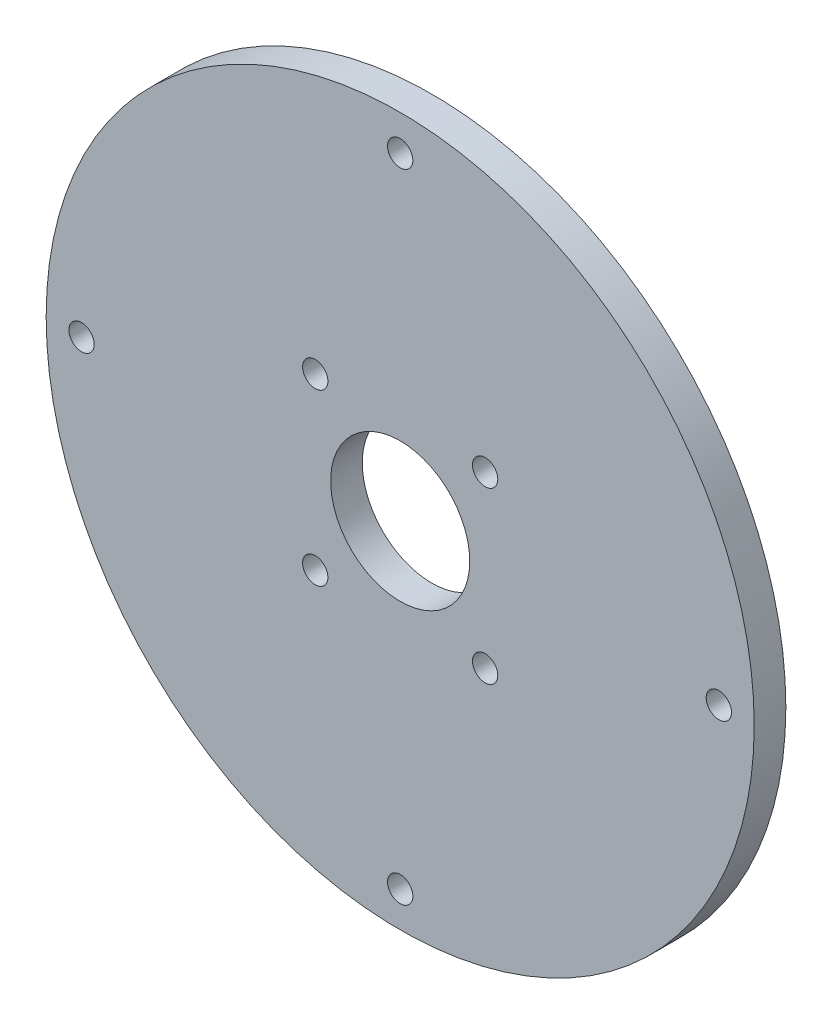
ISO-10303-21;
HEADER;
FILE_DESCRIPTION(('STEP AP214'),'2;1');
FILE_NAME('part.step','',(''),(''),'','','');
FILE_SCHEMA(('AUTOMOTIVE_DESIGN { 1 0 10303 214 1 1 1 1 }'));
ENDSEC;
DATA;
#1=APPLICATION_CONTEXT('core data for automotive mechanical design processes');
#2=APPLICATION_PROTOCOL_DEFINITION('international standard','automotive_design',2000,#1);
#3=PRODUCT_CONTEXT('',#1,'mechanical');
#4=PRODUCT('Part','Part','',(#3));
#5=PRODUCT_RELATED_PRODUCT_CATEGORY('part','',(#4));
#6=PRODUCT_DEFINITION_FORMATION('','',#4);
#7=PRODUCT_DEFINITION_CONTEXT('part definition',#1,'design');
#8=PRODUCT_DEFINITION('design','',#6,#7);
#9=PRODUCT_DEFINITION_SHAPE('','',#8);
#10=(LENGTH_UNIT() NAMED_UNIT(*) SI_UNIT(.MILLI.,.METRE.));
#11=(NAMED_UNIT(*) PLANE_ANGLE_UNIT() SI_UNIT($,.RADIAN.));
#12=(NAMED_UNIT(*) SI_UNIT($,.STERADIAN.) SOLID_ANGLE_UNIT());
#13=UNCERTAINTY_MEASURE_WITH_UNIT(LENGTH_MEASURE(1.E-05),#10,'distance_accuracy_value','');
#14=(GEOMETRIC_REPRESENTATION_CONTEXT(3) GLOBAL_UNCERTAINTY_ASSIGNED_CONTEXT((#13)) GLOBAL_UNIT_ASSIGNED_CONTEXT((#10,
#11,#12)) REPRESENTATION_CONTEXT('',''));
#15=CARTESIAN_POINT('',(0.,0.,0.));
#16=DIRECTION('',(0.,0.,1.));
#17=DIRECTION('',(1.,0.,0.));
#18=AXIS2_PLACEMENT_3D('',#15,#16,#17);
#19=CARTESIAN_POINT('',(0.,0.,2.5));
#20=DIRECTION('',(0.,0.,-1.));
#21=DIRECTION('',(-1.,0.,0.));
#22=AXIS2_PLACEMENT_3D('',#19,#20,#21);
#23=PLANE('',#22);
#24=CARTESIAN_POINT('',(0.,25.2,2.5));
#25=DIRECTION('',(0.,0.,1.));
#26=DIRECTION('',(1.,0.,0.));
#27=AXIS2_PLACEMENT_3D('',#24,#25,#26);
#28=CIRCLE('',#27,1.);
#29=CARTESIAN_POINT('',(1.,25.2,2.5));
#30=VERTEX_POINT('',#29);
#31=EDGE_CURVE('E92',#30,#30,#28,.T.);
#32=ORIENTED_EDGE('',*,*,#31,.F.);
#33=EDGE_LOOP('',(#32));
#34=FACE_BOUND('',#33,.T.);
#35=CARTESIAN_POINT('',(25.2000000000007,7.35731377640755E-13,2.5));
#36=DIRECTION('',(0.,0.,1.));
#37=DIRECTION('',(1.,0.,0.));
#38=AXIS2_PLACEMENT_3D('',#35,#36,#37);
#39=CIRCLE('',#38,1.);
#40=CARTESIAN_POINT('',(26.2000000000007,7.35731377640755E-13,2.5));
#41=VERTEX_POINT('',#40);
#42=EDGE_CURVE('E86',#41,#41,#39,.T.);
#43=ORIENTED_EDGE('',*,*,#42,.F.);
#44=EDGE_LOOP('',(#43));
#45=FACE_BOUND('',#44,.T.);
#46=CARTESIAN_POINT('',(1.47146275528151E-12,-25.2,2.5));
#47=DIRECTION('',(0.,0.,1.));
#48=DIRECTION('',(1.,0.,0.));
#49=AXIS2_PLACEMENT_3D('',#46,#47,#48);
#50=CIRCLE('',#49,1.);
#51=CARTESIAN_POINT('',(1.00000000000147,-25.2,2.5));
#52=VERTEX_POINT('',#51);
#53=EDGE_CURVE('E79',#52,#52,#50,.T.);
#54=ORIENTED_EDGE('',*,*,#53,.F.);
#55=EDGE_LOOP('',(#54));
#56=FACE_BOUND('',#55,.T.);
#57=CARTESIAN_POINT('',(-25.1999999999993,-7.38817487574606E-13,2.5));
#58=DIRECTION('',(0.,0.,1.));
#59=DIRECTION('',(1.,0.,0.));
#60=AXIS2_PLACEMENT_3D('',#57,#58,#59);
#61=CIRCLE('',#60,1.);
#62=CARTESIAN_POINT('',(-24.1999999999993,-7.38817487574606E-13,2.5));
#63=VERTEX_POINT('',#62);
#64=EDGE_CURVE('E80',#63,#63,#61,.T.);
#65=ORIENTED_EDGE('',*,*,#64,.F.);
#66=EDGE_LOOP('',(#65));
#67=FACE_BOUND('',#66,.T.);
#68=CARTESIAN_POINT('',(-6.71751442127182,-6.7175144212722,2.5));
#69=DIRECTION('',(0.,0.,1.));
#70=DIRECTION('',(1.,0.,0.));
#71=AXIS2_PLACEMENT_3D('',#68,#69,#70);
#72=CIRCLE('',#71,1.);
#73=CARTESIAN_POINT('',(-5.71751442127182,-6.7175144212722,2.5));
#74=VERTEX_POINT('',#73);
#75=EDGE_CURVE('E61',#74,#74,#72,.T.);
#76=ORIENTED_EDGE('',*,*,#75,.F.);
#77=EDGE_LOOP('',(#76));
#78=FACE_BOUND('',#77,.T.);
#79=CARTESIAN_POINT('',(6.71751442127258,-6.71751442127182,2.5));
#80=DIRECTION('',(0.,0.,1.));
#81=DIRECTION('',(1.,0.,0.));
#82=AXIS2_PLACEMENT_3D('',#79,#80,#81);
#83=CIRCLE('',#82,1.);
#84=CARTESIAN_POINT('',(7.71751442127258,-6.71751442127182,2.5));
#85=VERTEX_POINT('',#84);
#86=EDGE_CURVE('E55',#85,#85,#83,.T.);
#87=ORIENTED_EDGE('',*,*,#86,.F.);
#88=EDGE_LOOP('',(#87));
#89=FACE_BOUND('',#88,.T.);
#90=CARTESIAN_POINT('',(0.,0.,2.5));
#91=DIRECTION('',(0.,0.,1.));
#92=DIRECTION('',(1.,0.,0.));
#93=AXIS2_PLACEMENT_3D('',#90,#91,#92);
#94=CIRCLE('',#93,5.5);
#95=CARTESIAN_POINT('',(5.49999999999999,0.,2.5));
#96=VERTEX_POINT('',#95);
#97=EDGE_CURVE('E49',#96,#96,#94,.T.);
#98=ORIENTED_EDGE('',*,*,#97,.F.);
#99=EDGE_LOOP('',(#98));
#100=FACE_BOUND('',#99,.T.);
#101=CARTESIAN_POINT('',(6.7175144212722,6.71751442127258,2.5));
#102=DIRECTION('',(0.,0.,1.));
#103=DIRECTION('',(1.,0.,0.));
#104=AXIS2_PLACEMENT_3D('',#101,#102,#103);
#105=CIRCLE('',#104,1.);
#106=CARTESIAN_POINT('',(7.7175144212722,6.71751442127258,2.5));
#107=VERTEX_POINT('',#106);
#108=EDGE_CURVE('E44',#107,#107,#105,.T.);
#109=ORIENTED_EDGE('',*,*,#108,.F.);
#110=EDGE_LOOP('',(#109));
#111=FACE_BOUND('',#110,.T.);
#112=CARTESIAN_POINT('',(-6.7175144212722,6.7175144212722,2.5));
#113=DIRECTION('',(0.,0.,1.));
#114=DIRECTION('',(1.,0.,0.));
#115=AXIS2_PLACEMENT_3D('',#112,#113,#114);
#116=CIRCLE('',#115,1.);
#117=CARTESIAN_POINT('',(-5.7175144212722,6.7175144212722,2.5));
#118=VERTEX_POINT('',#117);
#119=EDGE_CURVE('E10',#118,#118,#116,.T.);
#120=ORIENTED_EDGE('',*,*,#119,.F.);
#121=EDGE_LOOP('',(#120));
#122=FACE_BOUND('',#121,.T.);
#123=CARTESIAN_POINT('',(0.,0.,2.5));
#124=DIRECTION('',(0.,0.,1.));
#125=DIRECTION('',(1.,0.,0.));
#126=AXIS2_PLACEMENT_3D('',#123,#124,#125);
#127=CIRCLE('',#126,28.);
#128=CARTESIAN_POINT('',(28.,0.,2.5));
#129=VERTEX_POINT('',#128);
#130=EDGE_CURVE('E70',#129,#129,#127,.T.);
#131=ORIENTED_EDGE('',*,*,#130,.T.);
#132=EDGE_LOOP('',(#131));
#133=FACE_BOUND('',#132,.T.);
#134=ADVANCED_FACE('F33',(#34,#45,#56,#67,#78,#89,#100,#111,#122,#133),#23,.F.);
#135=CARTESIAN_POINT('',(0.,0.,0.));
#136=DIRECTION('',(0.,0.,-1.));
#137=DIRECTION('',(-1.,0.,0.));
#138=AXIS2_PLACEMENT_3D('',#135,#136,#137);
#139=PLANE('',#138);
#140=CARTESIAN_POINT('',(0.,25.2,0.));
#141=DIRECTION('',(0.,0.,-1.));
#142=DIRECTION('',(-1.,0.,0.));
#143=AXIS2_PLACEMENT_3D('',#140,#141,#142);
#144=CIRCLE('',#143,1.);
#145=CARTESIAN_POINT('',(-1.,25.2,0.));
#146=VERTEX_POINT('',#145);
#147=EDGE_CURVE('E73',#146,#146,#144,.F.);
#148=ORIENTED_EDGE('',*,*,#147,.T.);
#149=EDGE_LOOP('',(#148));
#150=FACE_BOUND('',#149,.T.);
#151=CARTESIAN_POINT('',(25.2000000000007,7.35731377640755E-13,0.));
#152=DIRECTION('',(0.,0.,-1.));
#153=DIRECTION('',(-1.,0.,0.));
#154=AXIS2_PLACEMENT_3D('',#151,#152,#153);
#155=CIRCLE('',#154,1.);
#156=CARTESIAN_POINT('',(24.2000000000007,7.35731377640755E-13,0.));
#157=VERTEX_POINT('',#156);
#158=EDGE_CURVE('E89',#157,#157,#155,.F.);
#159=ORIENTED_EDGE('',*,*,#158,.T.);
#160=EDGE_LOOP('',(#159));
#161=FACE_BOUND('',#160,.T.);
#162=CARTESIAN_POINT('',(1.47146275528151E-12,-25.2,0.));
#163=DIRECTION('',(0.,0.,-1.));
#164=DIRECTION('',(-1.,0.,0.));
#165=AXIS2_PLACEMENT_3D('',#162,#163,#164);
#166=CIRCLE('',#165,1.);
#167=CARTESIAN_POINT('',(-0.999999999998529,-25.2,0.));
#168=VERTEX_POINT('',#167);
#169=EDGE_CURVE('E83',#168,#168,#166,.F.);
#170=ORIENTED_EDGE('',*,*,#169,.T.);
#171=EDGE_LOOP('',(#170));
#172=FACE_BOUND('',#171,.T.);
#173=CARTESIAN_POINT('',(-25.1999999999993,-7.38817487574606E-13,0.));
#174=DIRECTION('',(0.,0.,-1.));
#175=DIRECTION('',(-1.,0.,0.));
#176=AXIS2_PLACEMENT_3D('',#173,#174,#175);
#177=CIRCLE('',#176,1.);
#178=CARTESIAN_POINT('',(-26.1999999999993,-7.38817487574606E-13,0.));
#179=VERTEX_POINT('',#178);
#180=EDGE_CURVE('E76',#179,#179,#177,.F.);
#181=ORIENTED_EDGE('',*,*,#180,.T.);
#182=EDGE_LOOP('',(#181));
#183=FACE_BOUND('',#182,.T.);
#184=CARTESIAN_POINT('',(-6.71751442127182,-6.7175144212722,0.));
#185=DIRECTION('',(0.,0.,1.));
#186=DIRECTION('',(1.,0.,0.));
#187=AXIS2_PLACEMENT_3D('',#184,#185,#186);
#188=CIRCLE('',#187,1.);
#189=CARTESIAN_POINT('',(-5.71751442127182,-6.7175144212722,0.));
#190=VERTEX_POINT('',#189);
#191=EDGE_CURVE('E64',#190,#190,#188,.T.);
#192=ORIENTED_EDGE('',*,*,#191,.T.);
#193=EDGE_LOOP('',(#192));
#194=FACE_BOUND('',#193,.T.);
#195=CARTESIAN_POINT('',(0.,0.,0.));
#196=DIRECTION('',(0.,0.,1.));
#197=DIRECTION('',(1.,0.,0.));
#198=AXIS2_PLACEMENT_3D('',#195,#196,#197);
#199=CIRCLE('',#198,5.5);
#200=CARTESIAN_POINT('',(5.49999999999999,0.,0.));
#201=VERTEX_POINT('',#200);
#202=EDGE_CURVE('E52',#201,#201,#199,.T.);
#203=ORIENTED_EDGE('',*,*,#202,.T.);
#204=EDGE_LOOP('',(#203));
#205=FACE_BOUND('',#204,.T.);
#206=CARTESIAN_POINT('',(-6.7175144212722,6.7175144212722,0.));
#207=DIRECTION('',(0.,0.,1.));
#208=DIRECTION('',(1.,0.,0.));
#209=AXIS2_PLACEMENT_3D('',#206,#207,#208);
#210=CIRCLE('',#209,1.);
#211=CARTESIAN_POINT('',(-5.7175144212722,6.7175144212722,0.));
#212=VERTEX_POINT('',#211);
#213=EDGE_CURVE('E37',#212,#212,#210,.T.);
#214=ORIENTED_EDGE('',*,*,#213,.T.);
#215=EDGE_LOOP('',(#214));
#216=FACE_BOUND('',#215,.T.);
#217=CARTESIAN_POINT('',(6.7175144212722,6.71751442127258,0.));
#218=DIRECTION('',(0.,0.,1.));
#219=DIRECTION('',(1.,0.,0.));
#220=AXIS2_PLACEMENT_3D('',#217,#218,#219);
#221=CIRCLE('',#220,1.);
#222=CARTESIAN_POINT('',(7.7175144212722,6.71751442127258,0.));
#223=VERTEX_POINT('',#222);
#224=EDGE_CURVE('E46',#223,#223,#221,.T.);
#225=ORIENTED_EDGE('',*,*,#224,.T.);
#226=EDGE_LOOP('',(#225));
#227=FACE_BOUND('',#226,.T.);
#228=CARTESIAN_POINT('',(6.71751442127258,-6.71751442127182,0.));
#229=DIRECTION('',(0.,0.,1.));
#230=DIRECTION('',(1.,0.,0.));
#231=AXIS2_PLACEMENT_3D('',#228,#229,#230);
#232=CIRCLE('',#231,1.);
#233=CARTESIAN_POINT('',(7.71751442127258,-6.71751442127182,0.));
#234=VERTEX_POINT('',#233);
#235=EDGE_CURVE('E58',#234,#234,#232,.T.);
#236=ORIENTED_EDGE('',*,*,#235,.T.);
#237=EDGE_LOOP('',(#236));
#238=FACE_BOUND('',#237,.T.);
#239=CARTESIAN_POINT('',(0.,0.,0.));
#240=DIRECTION('',(0.,0.,1.));
#241=DIRECTION('',(1.,0.,0.));
#242=AXIS2_PLACEMENT_3D('',#239,#240,#241);
#243=CIRCLE('',#242,28.);
#244=CARTESIAN_POINT('',(28.,0.,0.));
#245=VERTEX_POINT('',#244);
#246=EDGE_CURVE('E67',#245,#245,#243,.T.);
#247=ORIENTED_EDGE('',*,*,#246,.F.);
#248=EDGE_LOOP('',(#247));
#249=FACE_BOUND('',#248,.T.);
#250=ADVANCED_FACE('F35',(#150,#161,#172,#183,#194,#205,#216,#227,#238,#249),#139,.T.);
#251=CARTESIAN_POINT('',(-6.7175144212722,6.7175144212722,2.5));
#252=DIRECTION('',(0.,0.,-1.));
#253=DIRECTION('',(-1.,0.,0.));
#254=AXIS2_PLACEMENT_3D('',#251,#252,#253);
#255=CYLINDRICAL_SURFACE('',#254,1.);
#256=ORIENTED_EDGE('',*,*,#119,.T.);
#257=EDGE_LOOP('',(#256));
#258=FACE_BOUND('',#257,.T.);
#259=ORIENTED_EDGE('',*,*,#213,.F.);
#260=EDGE_LOOP('',(#259));
#261=FACE_BOUND('',#260,.T.);
#262=ADVANCED_FACE('F150',(#258,#261),#255,.F.);
#263=CARTESIAN_POINT('',(6.7175144212722,6.71751442127258,2.5));
#264=DIRECTION('',(0.,0.,-1.));
#265=DIRECTION('',(-1.,0.,0.));
#266=AXIS2_PLACEMENT_3D('',#263,#264,#265);
#267=CYLINDRICAL_SURFACE('',#266,1.);
#268=ORIENTED_EDGE('',*,*,#108,.T.);
#269=EDGE_LOOP('',(#268));
#270=FACE_BOUND('',#269,.T.);
#271=ORIENTED_EDGE('',*,*,#224,.F.);
#272=EDGE_LOOP('',(#271));
#273=FACE_BOUND('',#272,.T.);
#274=ADVANCED_FACE('F146',(#270,#273),#267,.F.);
#275=CARTESIAN_POINT('',(0.,0.,2.5));
#276=DIRECTION('',(0.,0.,-1.));
#277=DIRECTION('',(-1.,0.,0.));
#278=AXIS2_PLACEMENT_3D('',#275,#276,#277);
#279=CYLINDRICAL_SURFACE('',#278,5.5);
#280=ORIENTED_EDGE('',*,*,#97,.T.);
#281=EDGE_LOOP('',(#280));
#282=FACE_BOUND('',#281,.T.);
#283=ORIENTED_EDGE('',*,*,#202,.F.);
#284=EDGE_LOOP('',(#283));
#285=FACE_BOUND('',#284,.T.);
#286=ADVANCED_FACE('F142',(#282,#285),#279,.F.);
#287=CARTESIAN_POINT('',(6.71751442127258,-6.71751442127182,2.5));
#288=DIRECTION('',(0.,0.,-1.));
#289=DIRECTION('',(-1.,0.,0.));
#290=AXIS2_PLACEMENT_3D('',#287,#288,#289);
#291=CYLINDRICAL_SURFACE('',#290,1.);
#292=ORIENTED_EDGE('',*,*,#86,.T.);
#293=EDGE_LOOP('',(#292));
#294=FACE_BOUND('',#293,.T.);
#295=ORIENTED_EDGE('',*,*,#235,.F.);
#296=EDGE_LOOP('',(#295));
#297=FACE_BOUND('',#296,.T.);
#298=ADVANCED_FACE('F135',(#294,#297),#291,.F.);
#299=CARTESIAN_POINT('',(-6.71751442127182,-6.7175144212722,2.5));
#300=DIRECTION('',(0.,0.,-1.));
#301=DIRECTION('',(-1.,0.,0.));
#302=AXIS2_PLACEMENT_3D('',#299,#300,#301);
#303=CYLINDRICAL_SURFACE('',#302,1.);
#304=ORIENTED_EDGE('',*,*,#75,.T.);
#305=EDGE_LOOP('',(#304));
#306=FACE_BOUND('',#305,.T.);
#307=ORIENTED_EDGE('',*,*,#191,.F.);
#308=EDGE_LOOP('',(#307));
#309=FACE_BOUND('',#308,.T.);
#310=ADVANCED_FACE('F125',(#306,#309),#303,.F.);
#311=CARTESIAN_POINT('',(0.,0.,0.));
#312=DIRECTION('',(0.,0.,1.));
#313=DIRECTION('',(1.,0.,0.));
#314=AXIS2_PLACEMENT_3D('',#311,#312,#313);
#315=CYLINDRICAL_SURFACE('',#314,28.);
#316=ORIENTED_EDGE('',*,*,#246,.T.);
#317=EDGE_LOOP('',(#316));
#318=FACE_BOUND('',#317,.T.);
#319=ORIENTED_EDGE('',*,*,#130,.F.);
#320=EDGE_LOOP('',(#319));
#321=FACE_BOUND('',#320,.T.);
#322=ADVANCED_FACE('F122',(#318,#321),#315,.T.);
#323=CARTESIAN_POINT('',(-25.1999999999993,-7.38817487574606E-13,-2.82842712474619));
#324=DIRECTION('',(0.,0.,1.));
#325=DIRECTION('',(1.,0.,0.));
#326=AXIS2_PLACEMENT_3D('',#323,#324,#325);
#327=CYLINDRICAL_SURFACE('',#326,1.);
#328=ORIENTED_EDGE('',*,*,#64,.T.);
#329=EDGE_LOOP('',(#328));
#330=FACE_BOUND('',#329,.T.);
#331=ORIENTED_EDGE('',*,*,#180,.F.);
#332=EDGE_LOOP('',(#331));
#333=FACE_BOUND('',#332,.T.);
#334=ADVANCED_FACE('F124',(#330,#333),#327,.F.);
#335=CARTESIAN_POINT('',(1.47146275528151E-12,-25.2,-2.82842712474619));
#336=DIRECTION('',(0.,0.,1.));
#337=DIRECTION('',(1.,0.,0.));
#338=AXIS2_PLACEMENT_3D('',#335,#336,#337);
#339=CYLINDRICAL_SURFACE('',#338,1.);
#340=ORIENTED_EDGE('',*,*,#53,.T.);
#341=EDGE_LOOP('',(#340));
#342=FACE_BOUND('',#341,.T.);
#343=ORIENTED_EDGE('',*,*,#169,.F.);
#344=EDGE_LOOP('',(#343));
#345=FACE_BOUND('',#344,.T.);
#346=ADVANCED_FACE('F132',(#342,#345),#339,.F.);
#347=CARTESIAN_POINT('',(25.2000000000007,7.35731377640755E-13,-2.82842712474619));
#348=DIRECTION('',(0.,0.,1.));
#349=DIRECTION('',(1.,0.,0.));
#350=AXIS2_PLACEMENT_3D('',#347,#348,#349);
#351=CYLINDRICAL_SURFACE('',#350,1.);
#352=ORIENTED_EDGE('',*,*,#42,.T.);
#353=EDGE_LOOP('',(#352));
#354=FACE_BOUND('',#353,.T.);
#355=ORIENTED_EDGE('',*,*,#158,.F.);
#356=EDGE_LOOP('',(#355));
#357=FACE_BOUND('',#356,.T.);
#358=ADVANCED_FACE('F186',(#354,#357),#351,.F.);
#359=CARTESIAN_POINT('',(0.,25.2,-2.82842712474619));
#360=DIRECTION('',(0.,0.,1.));
#361=DIRECTION('',(1.,0.,0.));
#362=AXIS2_PLACEMENT_3D('',#359,#360,#361);
#363=CYLINDRICAL_SURFACE('',#362,1.);
#364=ORIENTED_EDGE('',*,*,#31,.T.);
#365=EDGE_LOOP('',(#364));
#366=FACE_BOUND('',#365,.T.);
#367=ORIENTED_EDGE('',*,*,#147,.F.);
#368=EDGE_LOOP('',(#367));
#369=FACE_BOUND('',#368,.T.);
#370=ADVANCED_FACE('F100',(#366,#369),#363,.F.);
#371=CLOSED_SHELL('',(#134,#250,#262,#274,#286,#298,#310,#322,#334,#346,#358,#370));
#372=MANIFOLD_SOLID_BREP('B2',#371);
#373=ADVANCED_BREP_SHAPE_REPRESENTATION('',(#18,#372),#14);
#374=SHAPE_DEFINITION_REPRESENTATION(#9,#373);
ENDSEC;
END-ISO-10303-21;
